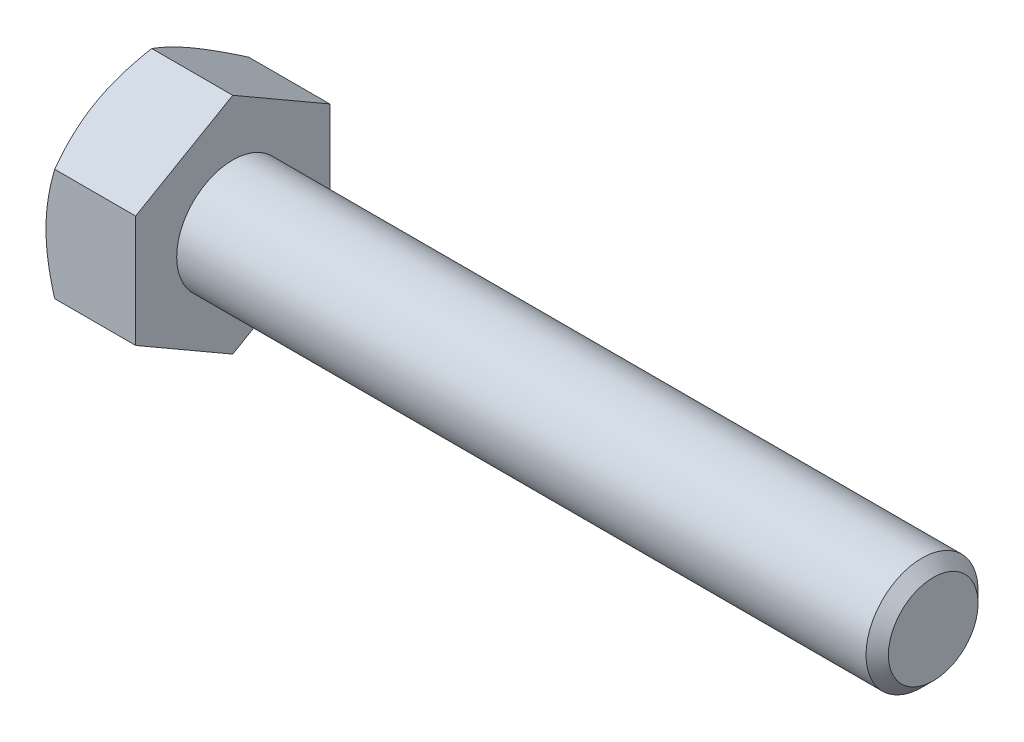
ISO-10303-21;
HEADER;
FILE_DESCRIPTION(('STEP AP214'),'2;1');
FILE_NAME('part.step','',(''),(''),'','','');
FILE_SCHEMA(('AUTOMOTIVE_DESIGN { 1 0 10303 214 1 1 1 1 }'));
ENDSEC;
DATA;
#1=APPLICATION_CONTEXT('core data for automotive mechanical design processes');
#2=APPLICATION_PROTOCOL_DEFINITION('international standard','automotive_design',2000,#1);
#3=PRODUCT_CONTEXT('',#1,'mechanical');
#4=PRODUCT('Part','Part','',(#3));
#5=PRODUCT_RELATED_PRODUCT_CATEGORY('part','',(#4));
#6=PRODUCT_DEFINITION_FORMATION('','',#4);
#7=PRODUCT_DEFINITION_CONTEXT('part definition',#1,'design');
#8=PRODUCT_DEFINITION('design','',#6,#7);
#9=PRODUCT_DEFINITION_SHAPE('','',#8);
#10=(LENGTH_UNIT() NAMED_UNIT(*) SI_UNIT(.MILLI.,.METRE.));
#11=(NAMED_UNIT(*) PLANE_ANGLE_UNIT() SI_UNIT($,.RADIAN.));
#12=(NAMED_UNIT(*) SI_UNIT($,.STERADIAN.) SOLID_ANGLE_UNIT());
#13=UNCERTAINTY_MEASURE_WITH_UNIT(LENGTH_MEASURE(1.E-05),#10,'distance_accuracy_value','');
#14=(GEOMETRIC_REPRESENTATION_CONTEXT(3) GLOBAL_UNCERTAINTY_ASSIGNED_CONTEXT((#13)) GLOBAL_UNIT_ASSIGNED_CONTEXT((#10,
#11,#12)) REPRESENTATION_CONTEXT('',''));
#15=CARTESIAN_POINT('',(0.,0.,0.));
#16=DIRECTION('',(0.,0.,1.));
#17=DIRECTION('',(1.,0.,0.));
#18=AXIS2_PLACEMENT_3D('',#15,#16,#17);
#19=CARTESIAN_POINT('',(19.2,-24.,0.));
#20=DIRECTION('',(0.,0.866025403784439,0.5));
#21=DIRECTION('',(0.,-0.5,0.866025403784439));
#22=AXIS2_PLACEMENT_3D('',#19,#20,#21);
#23=PLANE('',#22);
#24=CARTESIAN_POINT('',(1.85647312769879,-11.9998845299462,-20.7848096908265));
#25=CARTESIAN_POINT('',(1.70420497682991,-12.2636394383128,-20.3279727887898));
#26=CARTESIAN_POINT('',(1.55884654250784,-12.5284231322602,-19.8693539778572));
#27=CARTESIAN_POINT('',(1.28386975831447,-13.0601137691589,-18.94843878084));
#28=CARTESIAN_POINT('',(1.15425658531418,-13.3270213798629,-18.4861412381739));
#29=CARTESIAN_POINT('',(0.91251259584675,-13.8634756923534,-17.5569751130009));
#30=CARTESIAN_POINT('',(0.800423144133503,-14.1330270885871,-17.090098399473));
#31=CARTESIAN_POINT('',(0.596133528378372,-14.6740028630393,-16.1531008724579));
#32=CARTESIAN_POINT('',(0.503932225275743,-14.9454271330726,-15.6829802463528));
#33=CARTESIAN_POINT('',(0.343340490949204,-15.4831938662327,-14.7515409418993));
#34=CARTESIAN_POINT('',(0.274418527658162,-15.7494964060008,-14.2902914128362));
#35=CARTESIAN_POINT('',(0.158852016136895,-16.2833217102036,-13.3656788635911));
#36=CARTESIAN_POINT('',(0.112207896719893,-16.550844498026,-12.9023158029002));
#37=CARTESIAN_POINT('',(0.0423748141827231,-17.0863394659307,-11.9748113112918));
#38=CARTESIAN_POINT('',(0.019157979528038,-17.3543107311895,-11.5106714648951));
#39=CARTESIAN_POINT('',(-0.00332126042467924,-17.8905005573784,-10.5819634434344));
#40=CARTESIAN_POINT('',(-0.00258440592872337,-18.1587191104109,-10.1173952820495));
#41=CARTESIAN_POINT('',(0.0211707638629703,-18.6601588540007,-9.24887616921765));
#42=CARTESIAN_POINT('',(0.0412923456682149,-18.8934157559948,-8.84486336374767));
#43=CARTESIAN_POINT('',(0.0992698070061952,-19.3593726906644,-8.03780227876085));
#44=CARTESIAN_POINT('',(0.137125432541251,-19.5920727312676,-7.63475398551279));
#45=CARTESIAN_POINT('',(0.229914897964639,-20.0568299673038,-6.82977083951291));
#46=CARTESIAN_POINT('',(0.284864181366468,-20.2888863892025,-6.42783732656166));
#47=CARTESIAN_POINT('',(0.410868445121498,-20.7518881017849,-5.62589483637754));
#48=CARTESIAN_POINT('',(0.4819233572336,-20.9828333971723,-5.22588585099759));
#49=CARTESIAN_POINT('',(0.721070058737215,-21.6839341778009,-4.01154367772263));
#50=CARTESIAN_POINT('',(0.913020547282516,-22.1520977019199,-3.20066066769799));
#51=CARTESIAN_POINT('',(1.23980731969377,-22.8491727977797,-1.99329118497797));
#52=CARTESIAN_POINT('',(1.35509548926814,-23.0804697165365,-1.59267317005704));
#53=CARTESIAN_POINT('',(1.59734334708932,-23.541463698911,-0.794208170600854));
#54=CARTESIAN_POINT('',(1.72429974567885,-23.7711611939319,-0.396360438853306));
#55=CARTESIAN_POINT('',(1.8564731276988,-24.0001154700538,0.000200000000007566));
#56=B_SPLINE_CURVE_WITH_KNOTS('',3,(#24,#25,#26,#27,#28,#29,#30,#31,#32,#33,#34,#35,#36,#37,#38,
#39,#40,#41,#42,#43,#44,#45,#46,#47,#48,#49,#50,#51,#52,#53,#54,#55),.UNSPECIFIED.,.F.,.F.,(4,2,
2,2,2,2,2,2,2,2,2,2,2,2,2,4),(0.,1.64718297300076,3.29490606443561,4.94646171874215,
6.59792275780601,8.2086223270406,9.81935289844249,11.4281649098404,13.0369272065082,
14.4374315945823,15.8379159244004,17.2396692350121,18.6414166063712,21.5066563429885,
22.9367804503372,24.3665025883493),.UNSPECIFIED.);
#57=CARTESIAN_POINT('',(1.85640646055101,-12.,-20.7846096908265));
#58=VERTEX_POINT('',#57);
#59=CARTESIAN_POINT('',(0.,-18.,-10.3923048454133));
#60=VERTEX_POINT('',#59);
#61=EDGE_CURVE('E147',#58,#60,#56,.T.);
#62=ORIENTED_EDGE('',*,*,#61,.F.);
#63=DIRECTION('',(-1.,0.,0.));
#64=VECTOR('',#63,1.);
#65=CARTESIAN_POINT('',(19.2,-12.,-20.7846096908265));
#66=LINE('',#65,#64);
#67=CARTESIAN_POINT('',(19.2,-12.,-20.7846096908265));
#68=VERTEX_POINT('',#67);
#69=EDGE_CURVE('E161',#68,#58,#66,.T.);
#70=ORIENTED_EDGE('',*,*,#69,.F.);
#71=DIRECTION('',(0.,0.5,-0.866025403784439));
#72=VECTOR('',#71,1.);
#73=CARTESIAN_POINT('',(19.2,-24.,0.));
#74=LINE('',#73,#72);
#75=CARTESIAN_POINT('',(19.2,-24.,0.));
#76=VERTEX_POINT('',#75);
#77=EDGE_CURVE('E259',#76,#68,#74,.T.);
#78=ORIENTED_EDGE('',*,*,#77,.F.);
#79=DIRECTION('',(-1.,0.,0.));
#80=VECTOR('',#79,1.);
#81=CARTESIAN_POINT('',(19.2,-24.,0.));
#82=LINE('',#81,#80);
#83=CARTESIAN_POINT('',(1.85640646055101,-24.,0.));
#84=VERTEX_POINT('',#83);
#85=EDGE_CURVE('E280',#76,#84,#82,.T.);
#86=ORIENTED_EDGE('',*,*,#85,.T.);
#87=EDGE_CURVE('E214',#60,#84,#56,.T.);
#88=ORIENTED_EDGE('',*,*,#87,.F.);
#89=EDGE_LOOP('',(#62,#70,#78,#86,#88));
#90=FACE_BOUND('',#89,.T.);
#91=ADVANCED_FACE('F52',(#90),#23,.F.);
#92=CARTESIAN_POINT('',(19.2,-12.,-20.7846096908265));
#93=DIRECTION('',(0.,0.,1.));
#94=DIRECTION('',(1.,0.,0.));
#95=AXIS2_PLACEMENT_3D('',#92,#93,#94);
#96=PLANE('',#95);
#97=CARTESIAN_POINT('',(15.4365753826942,42.7351963396777,-20.7846096908265));
#98=CARTESIAN_POINT('',(15.1782001230141,42.2375504579258,-20.7846096908265));
#99=CARTESIAN_POINT('',(14.9205008424216,41.7395537279378,-20.7846096908265));
#100=CARTESIAN_POINT('',(14.4065935235221,40.7427897192709,-20.7846096908265));
#101=CARTESIAN_POINT('',(14.1503854894428,40.2440224384126,-20.7846096908265));
#102=CARTESIAN_POINT('',(13.3841874976782,38.7464229614954,-20.7846096908265));
#103=CARTESIAN_POINT('',(12.8766458079479,37.7463357499289,-20.7846096908265));
#104=CARTESIAN_POINT('',(11.8687046110495,35.740585285373,-20.7846096908265));
#105=CARTESIAN_POINT('',(11.3683176523895,34.7349157197309,-20.7846096908265));
#106=CARTESIAN_POINT('',(10.3773529444861,32.718765685221,-20.7846096908265));
#107=CARTESIAN_POINT('',(9.88677504418477,31.7082852907364,-20.7846096908265));
#108=CARTESIAN_POINT('',(8.89098212398311,29.6253151675214,-20.7846096908265));
#109=CARTESIAN_POINT('',(8.38646255239789,28.5524923063502,-20.7846096908265));
#110=CARTESIAN_POINT('',(7.39477343103312,26.398760720087,-20.7846096908265));
#111=CARTESIAN_POINT('',(6.9076046018839,25.3178516614009,-20.7846096908265));
#112=CARTESIAN_POINT('',(6.19395911010642,23.6893359387004,-20.7846096908265));
#113=CARTESIAN_POINT('',(5.95898796329796,23.1454489410646,-20.7846096908265));
#114=CARTESIAN_POINT('',(5.49555007418072,22.0549139153183,-20.7846096908265));
#115=CARTESIAN_POINT('',(5.26708324689029,21.5082659233915,-20.7846096908265));
#116=CARTESIAN_POINT('',(4.81763359191787,20.4119412090459,-20.7846096908265));
#117=CARTESIAN_POINT('',(4.59665024200561,19.8622647010961,-20.7846096908265));
#118=CARTESIAN_POINT('',(4.16330092883257,18.7595322812737,-20.7846096908265));
#119=CARTESIAN_POINT('',(3.9509347919298,18.2064764377555,-20.7846096908265));
#120=CARTESIAN_POINT('',(3.50964661408538,17.0257175003698,-20.7846096908265));
#121=CARTESIAN_POINT('',(3.28207699733136,16.3975069770108,-20.7846096908265));
#122=CARTESIAN_POINT('',(2.84185286992129,15.1358634730652,-20.7846096908265));
#123=CARTESIAN_POINT('',(2.62919832486909,14.502430504526,-20.7846096908265));
#124=CARTESIAN_POINT('',(2.22142797041994,13.2297874539747,-20.7846096908265));
#125=CARTESIAN_POINT('',(2.02631541783626,12.5905763233441,-20.7846096908265));
#126=CARTESIAN_POINT('',(1.65674077494716,11.3061766050275,-20.7846096908265));
#127=CARTESIAN_POINT('',(1.48227865352407,10.6609880263503,-20.7846096908265));
#128=CARTESIAN_POINT('',(1.16069442824225,9.37757944037591,-20.7846096908265));
#129=CARTESIAN_POINT('',(1.01309291973355,8.73948035870573,-20.7846096908265));
#130=CARTESIAN_POINT('',(0.744428159888315,7.45773163993493,-20.7846096908265));
#131=CARTESIAN_POINT('',(0.623362581757378,6.81408249463786,-20.7846096908265));
#132=CARTESIAN_POINT('',(0.411160078732887,5.52212335543822,-20.7846096908265));
#133=CARTESIAN_POINT('',(0.32000954243902,4.87381561880368,-20.7846096908265));
#134=CARTESIAN_POINT('',(0.170501882779787,3.57339987577272,-20.7846096908265));
#135=CARTESIAN_POINT('',(0.112144274499399,2.92129192571484,-20.7846096908265));
#136=CARTESIAN_POINT('',(0.0296859334714005,1.60463292415903,-20.7846096908265));
#137=CARTESIAN_POINT('',(0.00613586787264648,0.940046910142551,-20.7846096908265));
#138=CARTESIAN_POINT('',(-0.00403039108904673,-0.389409138129738,-20.7846096908265));
#139=CARTESIAN_POINT('',(0.00935336688645092,-1.05427917201018,-20.7846096908265));
#140=CARTESIAN_POINT('',(0.0725267417839732,-2.38241239876368,-20.7846096908265));
#141=CARTESIAN_POINT('',(0.122324318983761,-3.04567520847448,-20.7846096908265));
#142=CARTESIAN_POINT('',(0.256441221489194,-4.36867761851293,-20.7846096908265));
#143=CARTESIAN_POINT('',(0.340761456006634,-5.02841712558489,-20.7846096908265));
#144=CARTESIAN_POINT('',(0.543132854242181,-6.356870471909,-20.7846096908265));
#145=CARTESIAN_POINT('',(0.661856749114902,-7.02548085274416,-20.7846096908265));
#146=CARTESIAN_POINT('',(0.928598305854007,-8.3567871779243,-20.7846096908265));
#147=CARTESIAN_POINT('',(1.07661642314573,-9.01948303015109,-20.7846096908265));
#148=CARTESIAN_POINT('',(1.39817496043687,-10.3388158753969,-20.7846096908265));
#149=CARTESIAN_POINT('',(1.57172301041281,-10.9954509945151,-20.7846096908265));
#150=CARTESIAN_POINT('',(1.94066974695682,-12.3025159921132,-20.7846096908265));
#151=CARTESIAN_POINT('',(2.13606850262355,-12.9529458509631,-20.7846096908265));
#152=CARTESIAN_POINT('',(2.54787647733614,-14.2556215747884,-20.7846096908265));
#153=CARTESIAN_POINT('',(2.76450834199086,-14.907796699128,-20.7846096908265));
#154=CARTESIAN_POINT('',(3.21385089652053,-16.2066062021253,-20.7846096908265));
#155=CARTESIAN_POINT('',(3.44656260738666,-16.8532402260148,-20.7846096908265));
#156=CARTESIAN_POINT('',(3.92560832114499,-18.1416069191262,-20.7846096908265));
#157=CARTESIAN_POINT('',(4.17194567395357,-18.7833383384918,-20.7846096908265));
#158=CARTESIAN_POINT('',(4.6760882498381,-20.0622534059696,-20.7846096908265));
#159=CARTESIAN_POINT('',(4.93389324742563,-20.6994371432173,-20.7846096908265));
#160=CARTESIAN_POINT('',(5.45957252564695,-21.9705929002848,-20.7846096908265));
#161=CARTESIAN_POINT('',(5.72745939094395,-22.604559704099,-20.7846096908265));
#162=CARTESIAN_POINT('',(6.27153990979843,-23.8689150095967,-20.7846096908265));
#163=CARTESIAN_POINT('',(6.54773359625539,-24.4993034970964,-20.7846096908265));
#164=CARTESIAN_POINT('',(7.10718593411258,-25.7568294075045,-20.7846096908265));
#165=CARTESIAN_POINT('',(7.39044360966609,-26.3839672651679,-20.7846096908265));
#166=CARTESIAN_POINT('',(7.96306773382718,-27.6354418873609,-20.7846096908265));
#167=CARTESIAN_POINT('',(8.2524341698265,-28.2597786576686,-20.7846096908265));
#168=CARTESIAN_POINT('',(9.09261210441166,-30.0526700155559,-20.7846096908265));
#169=CARTESIAN_POINT('',(9.650064020441,-31.2181138600505,-20.7846096908265));
#170=CARTESIAN_POINT('',(10.7792267251682,-33.5421025420665,-20.7846096908265));
#171=CARTESIAN_POINT('',(11.3509380716336,-34.7006471075152,-20.7846096908265));
#172=CARTESIAN_POINT('',(12.5033567528949,-37.0077945469623,-20.7846096908265));
#173=CARTESIAN_POINT('',(13.0840220705692,-38.1564184327317,-20.7846096908265));
#174=CARTESIAN_POINT('',(13.9616188799111,-39.8759132018086,-20.7846096908265));
#175=CARTESIAN_POINT('',(14.2552377532654,-40.4484792332988,-20.7846096908265));
#176=CARTESIAN_POINT('',(14.8444666900635,-41.5925826559036,-20.7846096908265));
#177=CARTESIAN_POINT('',(15.1400767444053,-42.164120051705,-20.7846096908265));
#178=CARTESIAN_POINT('',(15.4365753826942,-42.7351963396777,-20.7846096908265));
#179=B_SPLINE_CURVE_WITH_KNOTS('',3,(#97,#98,#99,#100,#101,#102,#103,#104,#105,#106,#107,#108,
#109,#110,#111,#112,#113,#114,#115,#116,#117,#118,#119,#120,#121,#122,#123,#124,#125,#126,#127,
#128,#129,#130,#131,#132,#133,#134,#135,#136,#137,#138,#139,#140,#141,#142,#143,#144,#145,#146,
#147,#148,#149,#150,#151,#152,#153,#154,#155,#156,#157,#158,#159,#160,#161,#162,#163,#164,#165,
#166,#167,#168,#169,#170,#171,#172,#173,#174,#175,#176,#177,#178),.UNSPECIFIED.,.F.,.F.,(4,2,2,
2,2,2,2,2,2,2,2,2,2,2,2,2,2,2,2,2,2,2,2,2,2,2,2,2,2,2,2,2,2,2,2,2,2,2,2,2,4),(0.,
1.68216511624376,3.3643349990115,6.72881886572706,10.0986173985111,13.468363996922,
17.0248524624178,20.5814884680961,22.3588742955726,24.1362368900912,25.9134751956865,
27.6906776710652,29.69499374197,31.6993051905018,33.7039879905968,35.7086677698428,
37.6730184948026,39.6371969073429,41.6004803719791,43.5637348044197,45.5577279859555,
47.5517185403391,49.5461451232969,51.5406242361864,53.5770909409603,55.6135893083398,
57.650697552863,59.6878122395322,61.7492048973111,63.810728563878,65.8727613364008,
67.9347535810604,69.9994111245146,72.0640768461977,74.1284589098883,76.192836713184,
80.068401521298,83.9441181633394,87.8052301786373,89.7356145319588,91.6659900672801),.UNSPECIFIED.);
#180=CARTESIAN_POINT('',(1.85640646055101,12.,-20.7846096908265));
#181=VERTEX_POINT('',#180);
#182=CARTESIAN_POINT('',(0.,0.,-20.7846096908265));
#183=VERTEX_POINT('',#182);
#184=EDGE_CURVE('E125',#181,#183,#179,.T.);
#185=ORIENTED_EDGE('',*,*,#184,.F.);
#186=DIRECTION('',(-1.,0.,0.));
#187=VECTOR('',#186,1.);
#188=CARTESIAN_POINT('',(19.2,12.,-20.7846096908265));
#189=LINE('',#188,#187);
#190=CARTESIAN_POINT('',(19.2,12.,-20.7846096908265));
#191=VERTEX_POINT('',#190);
#192=EDGE_CURVE('E292',#191,#181,#189,.T.);
#193=ORIENTED_EDGE('',*,*,#192,.F.);
#194=DIRECTION('',(0.,1.,0.));
#195=VECTOR('',#194,1.);
#196=CARTESIAN_POINT('',(19.2,-12.,-20.7846096908265));
#197=LINE('',#196,#195);
#198=EDGE_CURVE('E262',#68,#191,#197,.T.);
#199=ORIENTED_EDGE('',*,*,#198,.F.);
#200=ORIENTED_EDGE('',*,*,#69,.T.);
#201=EDGE_CURVE('E139',#183,#58,#179,.T.);
#202=ORIENTED_EDGE('',*,*,#201,.F.);
#203=EDGE_LOOP('',(#185,#193,#199,#200,#202));
#204=FACE_BOUND('',#203,.T.);
#205=ADVANCED_FACE('F159',(#204),#96,.F.);
#206=CARTESIAN_POINT('',(19.2,12.,-20.7846096908265));
#207=DIRECTION('',(0.,-0.866025403784438,0.5));
#208=DIRECTION('',(0.,-0.5,-0.866025403784439));
#209=AXIS2_PLACEMENT_3D('',#206,#207,#208);
#210=PLANE('',#209);
#211=CARTESIAN_POINT('',(1.8564731276988,24.0001154700538,0.000199999999997352));
#212=CARTESIAN_POINT('',(1.70420497682991,23.7363605616872,-0.456636902036747));
#213=CARTESIAN_POINT('',(1.55884654250784,23.4715768677398,-0.915255712969352));
#214=CARTESIAN_POINT('',(1.28386975831447,22.9398862308411,-1.83617090998653));
#215=CARTESIAN_POINT('',(1.15425658531418,22.6729786201371,-2.29846845265265));
#216=CARTESIAN_POINT('',(0.912512595846755,22.1365243076466,-3.22763457782562));
#217=CARTESIAN_POINT('',(0.800423144133506,21.8669729114129,-3.69451129135353));
#218=CARTESIAN_POINT('',(0.596133528378374,21.3259971369607,-4.63150881836863));
#219=CARTESIAN_POINT('',(0.503932225275747,21.0545728669274,-5.10162944447372));
#220=CARTESIAN_POINT('',(0.343340490949207,20.5168061337673,-6.03306874892725));
#221=CARTESIAN_POINT('',(0.274418527658164,20.2505035939992,-6.4943182779903));
#222=CARTESIAN_POINT('',(0.158852016136896,19.7166782897964,-7.41893082723539));
#223=CARTESIAN_POINT('',(0.112207896719896,19.449155501974,-7.88229388792627));
#224=CARTESIAN_POINT('',(0.0423748141827268,18.9136605340693,-8.8097983795347));
#225=CARTESIAN_POINT('',(0.0191579795280403,18.6456892688105,-9.2739382259314));
#226=CARTESIAN_POINT('',(-0.0033212604246786,18.1094994426216,-10.2026462473922));
#227=CARTESIAN_POINT('',(-0.00258440592872306,17.8412808895891,-10.667214408777));
#228=CARTESIAN_POINT('',(0.0211707638629709,17.3398411459993,-11.5357335216089));
#229=CARTESIAN_POINT('',(0.041292345668216,17.1065842440052,-11.9397463270788));
#230=CARTESIAN_POINT('',(0.099269807006196,16.6406273093356,-12.7468074120657));
#231=CARTESIAN_POINT('',(0.137125432541251,16.4079272687324,-13.1498557053137));
#232=CARTESIAN_POINT('',(0.229914897964638,15.9431700326962,-13.9548388513136));
#233=CARTESIAN_POINT('',(0.284864181366468,15.7111136107975,-14.3567723642648));
#234=CARTESIAN_POINT('',(0.410868445121498,15.2481118982151,-15.158714854449));
#235=CARTESIAN_POINT('',(0.4819233572336,15.0171666028277,-15.5587238398289));
#236=CARTESIAN_POINT('',(0.721070058737214,14.3160658221991,-16.7730660131039));
#237=CARTESIAN_POINT('',(0.913020547282517,13.8479022980801,-17.5839490231285));
#238=CARTESIAN_POINT('',(1.23980731969377,13.1508272022203,-18.7913185058485));
#239=CARTESIAN_POINT('',(1.35509548926814,12.9195302834635,-19.1919365207695));
#240=CARTESIAN_POINT('',(1.59734334708932,12.458536301089,-19.9904015202257));
#241=CARTESIAN_POINT('',(1.72429974567884,12.2288388060681,-20.3882492519732));
#242=CARTESIAN_POINT('',(1.85647312769879,11.9998845299462,-20.7848096908265));
#243=B_SPLINE_CURVE_WITH_KNOTS('',3,(#211,#212,#213,#214,#215,#216,#217,#218,#219,#220,#221,
#222,#223,#224,#225,#226,#227,#228,#229,#230,#231,#232,#233,#234,#235,#236,#237,#238,#239,#240,
#241,#242),.UNSPECIFIED.,.F.,.F.,(4,2,2,2,2,2,2,2,2,2,2,2,2,2,2,4),(0.,1.64718297300076,
3.29490606443561,4.94646171874214,6.59792275780601,8.2086223270406,9.81935289844249,
11.4281649098404,13.0369272065082,14.4374315945823,15.8379159244004,17.2396692350121,
18.6414166063712,21.5066563429885,22.9367804503371,24.3665025883493),.UNSPECIFIED.);
#244=CARTESIAN_POINT('',(1.85640646055101,24.,0.));
#245=VERTEX_POINT('',#244);
#246=CARTESIAN_POINT('',(0.,18.,-10.3923048454133));
#247=VERTEX_POINT('',#246);
#248=EDGE_CURVE('E69',#245,#247,#243,.T.);
#249=ORIENTED_EDGE('',*,*,#248,.F.);
#250=DIRECTION('',(-1.,0.,0.));
#251=VECTOR('',#250,1.);
#252=CARTESIAN_POINT('',(19.2,24.,0.));
#253=LINE('',#252,#251);
#254=CARTESIAN_POINT('',(19.2,24.,0.));
#255=VERTEX_POINT('',#254);
#256=EDGE_CURVE('E255',#255,#245,#253,.T.);
#257=ORIENTED_EDGE('',*,*,#256,.F.);
#258=DIRECTION('',(0.,0.5,0.866025403784438));
#259=VECTOR('',#258,1.);
#260=CARTESIAN_POINT('',(19.2,12.,-20.7846096908265));
#261=LINE('',#260,#259);
#262=EDGE_CURVE('E266',#191,#255,#261,.T.);
#263=ORIENTED_EDGE('',*,*,#262,.F.);
#264=ORIENTED_EDGE('',*,*,#192,.T.);
#265=EDGE_CURVE('E132',#247,#181,#243,.T.);
#266=ORIENTED_EDGE('',*,*,#265,.F.);
#267=EDGE_LOOP('',(#249,#257,#263,#264,#266));
#268=FACE_BOUND('',#267,.T.);
#269=ADVANCED_FACE('F226',(#268),#210,.F.);
#270=CARTESIAN_POINT('',(19.2,24.,0.));
#271=DIRECTION('',(0.,-0.866025403784439,-0.5));
#272=DIRECTION('',(0.,0.5,-0.866025403784439));
#273=AXIS2_PLACEMENT_3D('',#270,#271,#272);
#274=PLANE('',#273);
#275=CARTESIAN_POINT('',(1.8564731276988,11.9998845299462,20.7848096908265));
#276=CARTESIAN_POINT('',(1.70420497682991,12.2636394383128,20.3279727887898));
#277=CARTESIAN_POINT('',(1.55884654250784,12.5284231322602,19.8693539778572));
#278=CARTESIAN_POINT('',(1.28386975831447,13.0601137691589,18.94843878084));
#279=CARTESIAN_POINT('',(1.15425658531419,13.3270213798629,18.4861412381739));
#280=CARTESIAN_POINT('',(0.912512595846756,13.8634756923534,17.5569751130009));
#281=CARTESIAN_POINT('',(0.800423144133506,14.1330270885871,17.090098399473));
#282=CARTESIAN_POINT('',(0.596133528378374,14.6740028630393,16.1531008724579));
#283=CARTESIAN_POINT('',(0.503932225275748,14.9454271330726,15.6829802463528));
#284=CARTESIAN_POINT('',(0.343340490949208,15.4831938662327,14.7515409418993));
#285=CARTESIAN_POINT('',(0.274418527658166,15.7494964060008,14.2902914128362));
#286=CARTESIAN_POINT('',(0.158852016136898,16.2833217102036,13.3656788635911));
#287=CARTESIAN_POINT('',(0.112207896719896,16.550844498026,12.9023158029003));
#288=CARTESIAN_POINT('',(0.0423748141827266,17.0863394659307,11.9748113112918));
#289=CARTESIAN_POINT('',(0.0191579795280406,17.3543107311895,11.5106714648951));
#290=CARTESIAN_POINT('',(-0.00332126042467685,17.8905005573784,10.5819634434344));
#291=CARTESIAN_POINT('',(-0.00258440592872026,18.1587191104109,10.1173952820495));
#292=CARTESIAN_POINT('',(0.0211707638629732,18.6601588540007,9.24887616921766));
#293=CARTESIAN_POINT('',(0.041292345668217,18.8934157559948,8.84486336374767));
#294=CARTESIAN_POINT('',(0.099269807006197,19.3593726906644,8.03780227876086));
#295=CARTESIAN_POINT('',(0.137125432541253,19.5920727312676,7.63475398551279));
#296=CARTESIAN_POINT('',(0.229914897964641,20.0568299673038,6.82977083951291));
#297=CARTESIAN_POINT('',(0.284864181366471,20.2888863892025,6.42783732656167));
#298=CARTESIAN_POINT('',(0.410868445121501,20.7518881017849,5.62589483637754));
#299=CARTESIAN_POINT('',(0.481923357233605,20.9828333971723,5.22588585099759));
#300=CARTESIAN_POINT('',(0.721070058737221,21.6839341778009,4.01154367772263));
#301=CARTESIAN_POINT('',(0.913020547282523,22.1520977019199,3.20066066769799));
#302=CARTESIAN_POINT('',(1.23980731969377,22.8491727977797,1.99329118497797));
#303=CARTESIAN_POINT('',(1.35509548926815,23.0804697165365,1.59267317005704));
#304=CARTESIAN_POINT('',(1.59734334708933,23.541463698911,0.794208170600857));
#305=CARTESIAN_POINT('',(1.72429974567885,23.7711611939319,0.39636043885331));
#306=CARTESIAN_POINT('',(1.8564731276988,24.0001154700538,-0.000200000000004068));
#307=B_SPLINE_CURVE_WITH_KNOTS('',3,(#275,#276,#277,#278,#279,#280,#281,#282,#283,#284,#285,
#286,#287,#288,#289,#290,#291,#292,#293,#294,#295,#296,#297,#298,#299,#300,#301,#302,#303,#304,
#305,#306),.UNSPECIFIED.,.F.,.F.,(4,2,2,2,2,2,2,2,2,2,2,2,2,2,2,4),(0.,1.64718297300077,
3.29490606443561,4.94646171874214,6.59792275780601,8.2086223270406,9.81935289844249,
11.4281649098404,13.0369272065082,14.4374315945823,15.8379159244004,17.2396692350121,
18.6414166063712,21.5066563429886,22.9367804503372,24.3665025883493),.UNSPECIFIED.);
#308=CARTESIAN_POINT('',(1.85640646055099,12.,20.7846096908265));
#309=VERTEX_POINT('',#308);
#310=CARTESIAN_POINT('',(0.,18.,10.3923048454133));
#311=VERTEX_POINT('',#310);
#312=EDGE_CURVE('E77',#309,#311,#307,.T.);
#313=ORIENTED_EDGE('',*,*,#312,.F.);
#314=DIRECTION('',(-1.,0.,0.));
#315=VECTOR('',#314,1.);
#316=CARTESIAN_POINT('',(19.2,12.,20.7846096908265));
#317=LINE('',#316,#315);
#318=CARTESIAN_POINT('',(19.2,12.,20.7846096908265));
#319=VERTEX_POINT('',#318);
#320=EDGE_CURVE('E287',#319,#309,#317,.T.);
#321=ORIENTED_EDGE('',*,*,#320,.F.);
#322=DIRECTION('',(0.,-0.5,0.866025403784439));
#323=VECTOR('',#322,1.);
#324=CARTESIAN_POINT('',(19.2,24.,0.));
#325=LINE('',#324,#323);
#326=EDGE_CURVE('E271',#255,#319,#325,.T.);
#327=ORIENTED_EDGE('',*,*,#326,.F.);
#328=ORIENTED_EDGE('',*,*,#256,.T.);
#329=EDGE_CURVE('E138',#311,#245,#307,.T.);
#330=ORIENTED_EDGE('',*,*,#329,.F.);
#331=EDGE_LOOP('',(#313,#321,#327,#328,#330));
#332=FACE_BOUND('',#331,.T.);
#333=ADVANCED_FACE('F250',(#332),#274,.F.);
#334=CARTESIAN_POINT('',(19.2,12.,20.7846096908265));
#335=DIRECTION('',(0.,0.,-1.));
#336=DIRECTION('',(-1.,0.,0.));
#337=AXIS2_PLACEMENT_3D('',#334,#335,#336);
#338=PLANE('',#337);
#339=CARTESIAN_POINT('',(15.4365753826942,-42.7351963396777,20.7846096908265));
#340=CARTESIAN_POINT('',(15.1782001230141,-42.2375504579258,20.7846096908265));
#341=CARTESIAN_POINT('',(14.9205008424216,-41.7395537279378,20.7846096908265));
#342=CARTESIAN_POINT('',(14.4065935235221,-40.7427897192709,20.7846096908265));
#343=CARTESIAN_POINT('',(14.1503854894428,-40.2440224384126,20.7846096908265));
#344=CARTESIAN_POINT('',(13.3841874976782,-38.7464229614954,20.7846096908265));
#345=CARTESIAN_POINT('',(12.8766458079479,-37.7463357499288,20.7846096908265));
#346=CARTESIAN_POINT('',(11.8687046110494,-35.7405852853729,20.7846096908265));
#347=CARTESIAN_POINT('',(11.3683176523895,-34.7349157197309,20.7846096908265));
#348=CARTESIAN_POINT('',(10.3773529444861,-32.718765685221,20.7846096908265));
#349=CARTESIAN_POINT('',(9.88677504418476,-31.7082852907364,20.7846096908265));
#350=CARTESIAN_POINT('',(8.89098212398311,-29.6253151675214,20.7846096908265));
#351=CARTESIAN_POINT('',(8.38646255239788,-28.5524923063502,20.7846096908265));
#352=CARTESIAN_POINT('',(7.39477343103312,-26.398760720087,20.7846096908265));
#353=CARTESIAN_POINT('',(6.90760460188389,-25.3178516614009,20.7846096908265));
#354=CARTESIAN_POINT('',(6.19395911010642,-23.6893359387004,20.7846096908265));
#355=CARTESIAN_POINT('',(5.95898796329796,-23.1454489410646,20.7846096908265));
#356=CARTESIAN_POINT('',(5.49555007418072,-22.0549139153183,20.7846096908265));
#357=CARTESIAN_POINT('',(5.26708324689028,-21.5082659233914,20.7846096908265));
#358=CARTESIAN_POINT('',(4.81763359191786,-20.4119412090459,20.7846096908265));
#359=CARTESIAN_POINT('',(4.5966502420056,-19.8622647010961,20.7846096908265));
#360=CARTESIAN_POINT('',(4.16330092883256,-18.7595322812737,20.7846096908265));
#361=CARTESIAN_POINT('',(3.95093479192979,-18.2064764377555,20.7846096908265));
#362=CARTESIAN_POINT('',(3.50964661408537,-17.0257175003698,20.7846096908265));
#363=CARTESIAN_POINT('',(3.28207699733136,-16.3975069770108,20.7846096908265));
#364=CARTESIAN_POINT('',(2.84185286992129,-15.1358634730652,20.7846096908265));
#365=CARTESIAN_POINT('',(2.62919832486908,-14.502430504526,20.7846096908265));
#366=CARTESIAN_POINT('',(2.22142797041994,-13.2297874539747,20.7846096908265));
#367=CARTESIAN_POINT('',(2.02631541783626,-12.5905763233441,20.7846096908265));
#368=CARTESIAN_POINT('',(1.65674077494716,-11.3061766050274,20.7846096908265));
#369=CARTESIAN_POINT('',(1.48227865352407,-10.6609880263503,20.7846096908265));
#370=CARTESIAN_POINT('',(1.16069442824225,-9.37757944037589,20.7846096908265));
#371=CARTESIAN_POINT('',(1.01309291973355,-8.73948035870571,20.7846096908265));
#372=CARTESIAN_POINT('',(0.744428159888316,-7.45773163993491,20.7846096908265));
#373=CARTESIAN_POINT('',(0.623362581757381,-6.81408249463783,20.7846096908265));
#374=CARTESIAN_POINT('',(0.411160078732891,-5.5221233554382,20.7846096908265));
#375=CARTESIAN_POINT('',(0.320009542439022,-4.87381561880365,20.7846096908265));
#376=CARTESIAN_POINT('',(0.170501882779789,-3.5733998757727,20.7846096908265));
#377=CARTESIAN_POINT('',(0.112144274499402,-2.92129192571482,20.7846096908265));
#378=CARTESIAN_POINT('',(0.0296859334714053,-1.60463292415902,20.7846096908265));
#379=CARTESIAN_POINT('',(0.00613586787265187,-0.940046910142535,20.7846096908265));
#380=CARTESIAN_POINT('',(-0.00403039108904013,0.389409138129753,20.7846096908265));
#381=CARTESIAN_POINT('',(0.00935336688645845,1.0542791720102,20.7846096908265));
#382=CARTESIAN_POINT('',(0.0725267417839815,2.3824123987637,20.7846096908265));
#383=CARTESIAN_POINT('',(0.12232431898377,3.0456752084745,20.7846096908265));
#384=CARTESIAN_POINT('',(0.256441221489202,4.36867761851294,20.7846096908265));
#385=CARTESIAN_POINT('',(0.340761456006642,5.02841712558491,20.7846096908265));
#386=CARTESIAN_POINT('',(0.54313285424219,6.35687047190901,20.7846096908265));
#387=CARTESIAN_POINT('',(0.66185674911491,7.02548085274418,20.7846096908265));
#388=CARTESIAN_POINT('',(0.928598305854015,8.35678717792432,20.7846096908265));
#389=CARTESIAN_POINT('',(1.07661642314574,9.01948303015111,20.7846096908265));
#390=CARTESIAN_POINT('',(1.39817496043688,10.3388158753969,20.7846096908265));
#391=CARTESIAN_POINT('',(1.57172301041282,10.9954509945151,20.7846096908265));
#392=CARTESIAN_POINT('',(1.94066974695683,12.3025159921133,20.7846096908265));
#393=CARTESIAN_POINT('',(2.13606850262356,12.9529458509631,20.7846096908265));
#394=CARTESIAN_POINT('',(2.54787647733615,14.2556215747884,20.7846096908265));
#395=CARTESIAN_POINT('',(2.76450834199087,14.9077966991281,20.7846096908265));
#396=CARTESIAN_POINT('',(3.21385089652054,16.2066062021254,20.7846096908265));
#397=CARTESIAN_POINT('',(3.44656260738666,16.8532402260149,20.7846096908265));
#398=CARTESIAN_POINT('',(3.925608321145,18.1416069191262,20.7846096908265));
#399=CARTESIAN_POINT('',(4.17194567395358,18.7833383384918,20.7846096908265));
#400=CARTESIAN_POINT('',(4.67608824983811,20.0622534059696,20.7846096908265));
#401=CARTESIAN_POINT('',(4.93389324742564,20.6994371432173,20.7846096908265));
#402=CARTESIAN_POINT('',(5.45957252564696,21.9705929002849,20.7846096908265));
#403=CARTESIAN_POINT('',(5.72745939094396,22.604559704099,20.7846096908265));
#404=CARTESIAN_POINT('',(6.27153990979845,23.8689150095967,20.7846096908265));
#405=CARTESIAN_POINT('',(6.54773359625541,24.4993034970964,20.7846096908265));
#406=CARTESIAN_POINT('',(7.10718593411259,25.7568294075045,20.7846096908265));
#407=CARTESIAN_POINT('',(7.3904436096661,26.3839672651679,20.7846096908265));
#408=CARTESIAN_POINT('',(7.96306773382719,27.6354418873609,20.7846096908265));
#409=CARTESIAN_POINT('',(8.25243416982651,28.2597786576686,20.7846096908265));
#410=CARTESIAN_POINT('',(9.09261210441168,30.052670015556,20.7846096908265));
#411=CARTESIAN_POINT('',(9.65006402044101,31.2181138600505,20.7846096908265));
#412=CARTESIAN_POINT('',(10.7792267251682,33.5421025420665,20.7846096908265));
#413=CARTESIAN_POINT('',(11.3509380716337,34.7006471075152,20.7846096908265));
#414=CARTESIAN_POINT('',(12.5033567528949,37.0077945469623,20.7846096908265));
#415=CARTESIAN_POINT('',(13.0840220705692,38.1564184327317,20.7846096908265));
#416=CARTESIAN_POINT('',(13.9616188799111,39.8759132018086,20.7846096908265));
#417=CARTESIAN_POINT('',(14.2552377532654,40.4484792332988,20.7846096908265));
#418=CARTESIAN_POINT('',(14.8444666900635,41.5925826559036,20.7846096908265));
#419=CARTESIAN_POINT('',(15.1400767444053,42.164120051705,20.7846096908265));
#420=CARTESIAN_POINT('',(15.4365753826942,42.7351963396777,20.7846096908265));
#421=B_SPLINE_CURVE_WITH_KNOTS('',3,(#339,#340,#341,#342,#343,#344,#345,#346,#347,#348,#349,
#350,#351,#352,#353,#354,#355,#356,#357,#358,#359,#360,#361,#362,#363,#364,#365,#366,#367,#368,
#369,#370,#371,#372,#373,#374,#375,#376,#377,#378,#379,#380,#381,#382,#383,#384,#385,#386,#387,
#388,#389,#390,#391,#392,#393,#394,#395,#396,#397,#398,#399,#400,#401,#402,#403,#404,#405,#406,
#407,#408,#409,#410,#411,#412,#413,#414,#415,#416,#417,#418,#419,#420),.UNSPECIFIED.,.F.,.F.,(4,
2,2,2,2,2,2,2,2,2,2,2,2,2,2,2,2,2,2,2,2,2,2,2,2,2,2,2,2,2,2,2,2,2,2,2,2,2,2,2,4),(0.,
1.68216511624377,3.36433499901151,6.72881886572707,10.0986173985111,13.4683639969219,
17.0248524624178,20.5814884680961,22.3588742955726,24.1362368900912,25.9134751956865,
27.6906776710652,29.69499374197,31.6993051905018,33.7039879905968,35.7086677698428,
37.6730184948026,39.6371969073429,41.6004803719791,43.5637348044197,45.5577279859555,
47.5517185403391,49.5461451232969,51.5406242361864,53.5770909409603,55.6135893083398,
57.650697552863,59.6878122395322,61.7492048973111,63.810728563878,65.8727613364008,
67.9347535810604,69.9994111245146,72.0640768461977,74.1284589098883,76.192836713184,
80.068401521298,83.9441181633394,87.8052301786373,89.7356145319588,91.6659900672801),.UNSPECIFIED.);
#422=CARTESIAN_POINT('',(1.85640646055101,-12.,20.7846096908265));
#423=VERTEX_POINT('',#422);
#424=CARTESIAN_POINT('',(0.,0.,20.7846096908265));
#425=VERTEX_POINT('',#424);
#426=EDGE_CURVE('E207',#423,#425,#421,.T.);
#427=ORIENTED_EDGE('',*,*,#426,.F.);
#428=DIRECTION('',(-1.,0.,0.));
#429=VECTOR('',#428,1.);
#430=CARTESIAN_POINT('',(19.2,-12.,20.7846096908265));
#431=LINE('',#430,#429);
#432=CARTESIAN_POINT('',(19.2,-12.,20.7846096908265));
#433=VERTEX_POINT('',#432);
#434=EDGE_CURVE('E283',#433,#423,#431,.T.);
#435=ORIENTED_EDGE('',*,*,#434,.F.);
#436=DIRECTION('',(0.,-1.,0.));
#437=VECTOR('',#436,1.);
#438=CARTESIAN_POINT('',(19.2,12.,20.7846096908265));
#439=LINE('',#438,#437);
#440=EDGE_CURVE('E274',#319,#433,#439,.T.);
#441=ORIENTED_EDGE('',*,*,#440,.F.);
#442=ORIENTED_EDGE('',*,*,#320,.T.);
#443=EDGE_CURVE('E164',#425,#309,#421,.T.);
#444=ORIENTED_EDGE('',*,*,#443,.F.);
#445=EDGE_LOOP('',(#427,#435,#441,#442,#444));
#446=FACE_BOUND('',#445,.T.);
#447=ADVANCED_FACE('F336',(#446),#338,.F.);
#448=CARTESIAN_POINT('',(19.2,-12.,20.7846096908265));
#449=DIRECTION('',(0.,0.866025403784438,-0.5));
#450=DIRECTION('',(0.,0.5,0.866025403784439));
#451=AXIS2_PLACEMENT_3D('',#448,#449,#450);
#452=PLANE('',#451);
#453=CARTESIAN_POINT('',(1.8564731276988,-24.0001154700538,-0.000199999999993102));
#454=CARTESIAN_POINT('',(1.70420497682991,-23.7363605616872,0.45663690203675));
#455=CARTESIAN_POINT('',(1.55884654250784,-23.4715768677398,0.915255712969354));
#456=CARTESIAN_POINT('',(1.28386975831447,-22.9398862308411,1.83617090998653));
#457=CARTESIAN_POINT('',(1.15425658531418,-22.6729786201371,2.29846845265266));
#458=CARTESIAN_POINT('',(0.912512595846753,-22.1365243076466,3.22763457782562));
#459=CARTESIAN_POINT('',(0.800423144133504,-21.8669729114129,3.69451129135354));
#460=CARTESIAN_POINT('',(0.596133528378372,-21.3259971369607,4.63150881836863));
#461=CARTESIAN_POINT('',(0.503932225275744,-21.0545728669274,5.10162944447372));
#462=CARTESIAN_POINT('',(0.343340490949204,-20.5168061337673,6.03306874892725));
#463=CARTESIAN_POINT('',(0.274418527658162,-20.2505035939992,6.4943182779903));
#464=CARTESIAN_POINT('',(0.158852016136895,-19.7166782897964,7.41893082723539));
#465=CARTESIAN_POINT('',(0.112207896719893,-19.449155501974,7.88229388792627));
#466=CARTESIAN_POINT('',(0.0423748141827218,-18.9136605340693,8.8097983795347));
#467=CARTESIAN_POINT('',(0.0191579795280349,-18.6456892688105,9.2739382259314));
#468=CARTESIAN_POINT('',(-0.00332126042468313,-18.1094994426216,10.2026462473922));
#469=CARTESIAN_POINT('',(-0.00258440592872628,-17.8412808895891,10.667214408777));
#470=CARTESIAN_POINT('',(0.0211707638629672,-17.3398411459993,11.5357335216089));
#471=CARTESIAN_POINT('',(0.0412923456682109,-17.1065842440052,11.9397463270788));
#472=CARTESIAN_POINT('',(0.0992698070061921,-16.6406273093356,12.7468074120657));
#473=CARTESIAN_POINT('',(0.137125432541249,-16.4079272687324,13.1498557053137));
#474=CARTESIAN_POINT('',(0.229914897964638,-15.9431700326962,13.9548388513136));
#475=CARTESIAN_POINT('',(0.284864181366466,-15.7111136107975,14.3567723642648));
#476=CARTESIAN_POINT('',(0.410868445121496,-15.2481118982151,15.158714854449));
#477=CARTESIAN_POINT('',(0.481923357233599,-15.0171666028277,15.5587238398289));
#478=CARTESIAN_POINT('',(0.721070058737216,-14.3160658221991,16.7730660131039));
#479=CARTESIAN_POINT('',(0.913020547282517,-13.8479022980801,17.5839490231285));
#480=CARTESIAN_POINT('',(1.23980731969377,-13.1508272022203,18.7913185058486));
#481=CARTESIAN_POINT('',(1.35509548926814,-12.9195302834635,19.1919365207695));
#482=CARTESIAN_POINT('',(1.59734334708932,-12.458536301089,19.9904015202257));
#483=CARTESIAN_POINT('',(1.72429974567884,-12.2288388060681,20.3882492519732));
#484=CARTESIAN_POINT('',(1.85647312769879,-11.9998845299462,20.7848096908265));
#485=B_SPLINE_CURVE_WITH_KNOTS('',3,(#453,#454,#455,#456,#457,#458,#459,#460,#461,#462,#463,
#464,#465,#466,#467,#468,#469,#470,#471,#472,#473,#474,#475,#476,#477,#478,#479,#480,#481,#482,
#483,#484),.UNSPECIFIED.,.F.,.F.,(4,2,2,2,2,2,2,2,2,2,2,2,2,2,2,4),(0.,1.64718297300076,
3.29490606443561,4.94646171874214,6.59792275780601,8.2086223270406,9.81935289844249,
11.4281649098404,13.0369272065082,14.4374315945823,15.8379159244004,17.2396692350121,
18.6414166063712,21.5066563429886,22.9367804503372,24.3665025883493),.UNSPECIFIED.);
#486=CARTESIAN_POINT('',(0.,-18.,10.3923048454133));
#487=VERTEX_POINT('',#486);
#488=EDGE_CURVE('E233',#84,#487,#485,.T.);
#489=ORIENTED_EDGE('',*,*,#488,.F.);
#490=ORIENTED_EDGE('',*,*,#85,.F.);
#491=DIRECTION('',(0.,-0.5,-0.866025403784439));
#492=VECTOR('',#491,1.);
#493=CARTESIAN_POINT('',(19.2,-12.,20.7846096908265));
#494=LINE('',#493,#492);
#495=EDGE_CURVE('E277',#433,#76,#494,.T.);
#496=ORIENTED_EDGE('',*,*,#495,.F.);
#497=ORIENTED_EDGE('',*,*,#434,.T.);
#498=EDGE_CURVE('E197',#487,#423,#485,.T.);
#499=ORIENTED_EDGE('',*,*,#498,.F.);
#500=EDGE_LOOP('',(#489,#490,#496,#497,#499));
#501=FACE_BOUND('',#500,.T.);
#502=ADVANCED_FACE('F331',(#501),#452,.F.);
#503=CARTESIAN_POINT('',(19.2,0.,0.));
#504=DIRECTION('',(1.,0.,0.));
#505=DIRECTION('',(0.,0.,-1.));
#506=AXIS2_PLACEMENT_3D('',#503,#504,#505);
#507=PLANE('',#506);
#508=CARTESIAN_POINT('',(19.2,0.,0.));
#509=DIRECTION('',(1.,0.,0.));
#510=DIRECTION('',(0.,0.,-1.));
#511=AXIS2_PLACEMENT_3D('',#508,#509,#510);
#512=CIRCLE('',#511,12.);
#513=CARTESIAN_POINT('',(19.2,0.,-12.));
#514=VERTEX_POINT('',#513);
#515=EDGE_CURVE('E152',#514,#514,#512,.T.);
#516=ORIENTED_EDGE('',*,*,#515,.F.);
#517=EDGE_LOOP('',(#516));
#518=FACE_BOUND('',#517,.T.);
#519=ORIENTED_EDGE('',*,*,#77,.T.);
#520=ORIENTED_EDGE('',*,*,#198,.T.);
#521=ORIENTED_EDGE('',*,*,#262,.T.);
#522=ORIENTED_EDGE('',*,*,#326,.T.);
#523=ORIENTED_EDGE('',*,*,#440,.T.);
#524=ORIENTED_EDGE('',*,*,#495,.T.);
#525=EDGE_LOOP('',(#519,#520,#521,#522,#523,#524));
#526=FACE_BOUND('',#525,.T.);
#527=ADVANCED_FACE('F312',(#518,#526),#507,.T.);
#528=CARTESIAN_POINT('',(169.2,0.,0.));
#529=DIRECTION('',(-1.,0.,0.));
#530=DIRECTION('',(0.,0.,1.));
#531=AXIS2_PLACEMENT_3D('',#528,#529,#530);
#532=CYLINDRICAL_SURFACE('',#531,12.);
#533=CARTESIAN_POINT('',(166.8,0.,0.));
#534=DIRECTION('',(1.,0.,0.));
#535=DIRECTION('',(0.,0.,-1.));
#536=AXIS2_PLACEMENT_3D('',#533,#534,#535);
#537=CIRCLE('',#536,12.);
#538=CARTESIAN_POINT('',(166.8,0.,12.));
#539=VERTEX_POINT('',#538);
#540=EDGE_CURVE('E12',#539,#539,#537,.F.);
#541=ORIENTED_EDGE('',*,*,#540,.T.);
#542=EDGE_LOOP('',(#541));
#543=FACE_BOUND('',#542,.T.);
#544=ORIENTED_EDGE('',*,*,#515,.T.);
#545=EDGE_LOOP('',(#544));
#546=FACE_BOUND('',#545,.T.);
#547=ADVANCED_FACE('F309',(#543,#546),#532,.T.);
#548=CARTESIAN_POINT('',(169.2,0.,0.));
#549=DIRECTION('',(1.,0.,0.));
#550=DIRECTION('',(0.,0.,-1.));
#551=AXIS2_PLACEMENT_3D('',#548,#549,#550);
#552=PLANE('',#551);
#553=CARTESIAN_POINT('',(169.2,0.,0.));
#554=DIRECTION('',(1.,0.,0.));
#555=DIRECTION('',(0.,0.,-1.));
#556=AXIS2_PLACEMENT_3D('',#553,#554,#555);
#557=CIRCLE('',#556,9.59999999999994);
#558=CARTESIAN_POINT('',(169.2,0.,9.59999999999996));
#559=VERTEX_POINT('',#558);
#560=EDGE_CURVE('E62',#559,#559,#557,.T.);
#561=ORIENTED_EDGE('',*,*,#560,.T.);
#562=EDGE_LOOP('',(#561));
#563=FACE_BOUND('',#562,.T.);
#564=ADVANCED_FACE('F192',(#563),#552,.T.);
#565=CARTESIAN_POINT('',(0.,0.,0.));
#566=DIRECTION('',(1.,0.,0.));
#567=DIRECTION('',(0.,0.,1.));
#568=AXIS2_PLACEMENT_3D('',#565,#566,#567);
#569=CONICAL_SURFACE('',#568,20.7846096908265,1.0471975511966);
#570=ORIENTED_EDGE('',*,*,#201,.T.);
#571=ORIENTED_EDGE('',*,*,#61,.T.);
#572=CARTESIAN_POINT('',(0.,0.,0.));
#573=DIRECTION('',(1.,0.,0.));
#574=DIRECTION('',(0.,0.,-1.));
#575=AXIS2_PLACEMENT_3D('',#572,#573,#574);
#576=CIRCLE('',#575,20.7846096908265);
#577=EDGE_CURVE('E144',#60,#183,#576,.T.);
#578=ORIENTED_EDGE('',*,*,#577,.T.);
#579=EDGE_LOOP('',(#570,#571,#578));
#580=FACE_BOUND('',#579,.T.);
#581=ADVANCED_FACE('F145',(#580),#569,.T.);
#582=ORIENTED_EDGE('',*,*,#87,.T.);
#583=ORIENTED_EDGE('',*,*,#488,.T.);
#584=EDGE_CURVE('E151',#487,#60,#576,.T.);
#585=ORIENTED_EDGE('',*,*,#584,.T.);
#586=EDGE_LOOP('',(#582,#583,#585));
#587=FACE_BOUND('',#586,.T.);
#588=ADVANCED_FACE('F321',(#587),#569,.T.);
#589=ORIENTED_EDGE('',*,*,#426,.T.);
#590=EDGE_CURVE('E247',#425,#487,#576,.T.);
#591=ORIENTED_EDGE('',*,*,#590,.T.);
#592=ORIENTED_EDGE('',*,*,#498,.T.);
#593=EDGE_LOOP('',(#589,#591,#592));
#594=FACE_BOUND('',#593,.T.);
#595=ADVANCED_FACE('F191',(#594),#569,.T.);
#596=ORIENTED_EDGE('',*,*,#312,.T.);
#597=CARTESIAN_POINT('',(0.,0.,0.));
#598=DIRECTION('',(-1.,0.,0.));
#599=DIRECTION('',(0.,0.,1.));
#600=AXIS2_PLACEMENT_3D('',#597,#598,#599);
#601=CIRCLE('',#600,20.7846096908265);
#602=EDGE_CURVE('E243',#425,#311,#601,.T.);
#603=ORIENTED_EDGE('',*,*,#602,.F.);
#604=ORIENTED_EDGE('',*,*,#443,.T.);
#605=EDGE_LOOP('',(#596,#603,#604));
#606=FACE_BOUND('',#605,.T.);
#607=ADVANCED_FACE('F190',(#606),#569,.T.);
#608=ORIENTED_EDGE('',*,*,#248,.T.);
#609=EDGE_CURVE('E156',#247,#311,#576,.T.);
#610=ORIENTED_EDGE('',*,*,#609,.T.);
#611=ORIENTED_EDGE('',*,*,#329,.T.);
#612=EDGE_LOOP('',(#608,#610,#611));
#613=FACE_BOUND('',#612,.T.);
#614=ADVANCED_FACE('F186',(#613),#569,.T.);
#615=ORIENTED_EDGE('',*,*,#265,.T.);
#616=ORIENTED_EDGE('',*,*,#184,.T.);
#617=EDGE_CURVE('E129',#183,#247,#576,.T.);
#618=ORIENTED_EDGE('',*,*,#617,.T.);
#619=EDGE_LOOP('',(#615,#616,#618));
#620=FACE_BOUND('',#619,.T.);
#621=ADVANCED_FACE('F127',(#620),#569,.T.);
#622=CARTESIAN_POINT('',(0.,0.,0.));
#623=DIRECTION('',(1.,0.,0.));
#624=DIRECTION('',(0.,0.,-1.));
#625=AXIS2_PLACEMENT_3D('',#622,#623,#624);
#626=PLANE('',#625);
#627=ORIENTED_EDGE('',*,*,#617,.F.);
#628=ORIENTED_EDGE('',*,*,#577,.F.);
#629=ORIENTED_EDGE('',*,*,#584,.F.);
#630=ORIENTED_EDGE('',*,*,#590,.F.);
#631=ORIENTED_EDGE('',*,*,#602,.T.);
#632=ORIENTED_EDGE('',*,*,#609,.F.);
#633=EDGE_LOOP('',(#627,#628,#629,#630,#631,#632));
#634=FACE_BOUND('',#633,.T.);
#635=ADVANCED_FACE('F154',(#634),#626,.F.);
#636=CARTESIAN_POINT('',(169.2,0.,0.));
#637=DIRECTION('',(-1.,0.,0.));
#638=DIRECTION('',(0.,0.,1.));
#639=AXIS2_PLACEMENT_3D('',#636,#637,#638);
#640=CONICAL_SURFACE('',#639,9.59999999999994,0.785398163397452);
#641=CARTESIAN_POINT('',(166.8,0.,12.));
#642=CARTESIAN_POINT('',(166.825,0.,11.975));
#643=CARTESIAN_POINT('',(166.85,0.,11.95));
#644=CARTESIAN_POINT('',(166.9,0.,11.9));
#645=CARTESIAN_POINT('',(166.925,0.,11.875));
#646=CARTESIAN_POINT('',(166.975,0.,11.825));
#647=CARTESIAN_POINT('',(167.,0.,11.8));
#648=CARTESIAN_POINT('',(167.05,0.,11.75));
#649=CARTESIAN_POINT('',(167.075,0.,11.725));
#650=CARTESIAN_POINT('',(167.125,0.,11.675));
#651=CARTESIAN_POINT('',(167.15,0.,11.65));
#652=CARTESIAN_POINT('',(167.2,0.,11.6));
#653=CARTESIAN_POINT('',(167.225,0.,11.575));
#654=CARTESIAN_POINT('',(167.275,0.,11.525));
#655=CARTESIAN_POINT('',(167.3,0.,11.5));
#656=CARTESIAN_POINT('',(167.35,0.,11.45));
#657=CARTESIAN_POINT('',(167.375,0.,11.425));
#658=CARTESIAN_POINT('',(167.425,0.,11.375));
#659=CARTESIAN_POINT('',(167.45,0.,11.35));
#660=CARTESIAN_POINT('',(167.5,0.,11.3));
#661=CARTESIAN_POINT('',(167.525,0.,11.275));
#662=CARTESIAN_POINT('',(167.575,0.,11.225));
#663=CARTESIAN_POINT('',(167.6,0.,11.2));
#664=CARTESIAN_POINT('',(167.65,0.,11.15));
#665=CARTESIAN_POINT('',(167.675,0.,11.125));
#666=CARTESIAN_POINT('',(167.725,0.,11.075));
#667=CARTESIAN_POINT('',(167.75,0.,11.05));
#668=CARTESIAN_POINT('',(167.8,0.,11.));
#669=CARTESIAN_POINT('',(167.825,0.,10.975));
#670=CARTESIAN_POINT('',(167.875,0.,10.925));
#671=CARTESIAN_POINT('',(167.9,0.,10.9));
#672=CARTESIAN_POINT('',(167.95,0.,10.85));
#673=CARTESIAN_POINT('',(167.975,0.,10.825));
#674=CARTESIAN_POINT('',(168.025,0.,10.775));
#675=CARTESIAN_POINT('',(168.05,0.,10.75));
#676=CARTESIAN_POINT('',(168.1,0.,10.7));
#677=CARTESIAN_POINT('',(168.125,0.,10.675));
#678=CARTESIAN_POINT('',(168.175,0.,10.625));
#679=CARTESIAN_POINT('',(168.2,0.,10.6));
#680=CARTESIAN_POINT('',(168.25,0.,10.55));
#681=CARTESIAN_POINT('',(168.275,0.,10.525));
#682=CARTESIAN_POINT('',(168.325,0.,10.475));
#683=CARTESIAN_POINT('',(168.35,0.,10.45));
#684=CARTESIAN_POINT('',(168.4,0.,10.4));
#685=CARTESIAN_POINT('',(168.425,0.,10.375));
#686=CARTESIAN_POINT('',(168.475,0.,10.325));
#687=CARTESIAN_POINT('',(168.5,0.,10.3));
#688=CARTESIAN_POINT('',(168.55,0.,10.25));
#689=CARTESIAN_POINT('',(168.575,0.,10.225));
#690=CARTESIAN_POINT('',(168.625,0.,10.175));
#691=CARTESIAN_POINT('',(168.65,0.,10.15));
#692=CARTESIAN_POINT('',(168.7,0.,10.1));
#693=CARTESIAN_POINT('',(168.725,0.,10.075));
#694=CARTESIAN_POINT('',(168.775,0.,10.025));
#695=CARTESIAN_POINT('',(168.8,0.,9.99999999999997));
#696=CARTESIAN_POINT('',(168.85,0.,9.94999999999997));
#697=CARTESIAN_POINT('',(168.875,0.,9.92499999999997));
#698=CARTESIAN_POINT('',(168.925,0.,9.87499999999996));
#699=CARTESIAN_POINT('',(168.95,0.,9.84999999999996));
#700=CARTESIAN_POINT('',(169.,0.,9.79999999999996));
#701=CARTESIAN_POINT('',(169.025,0.,9.77499999999996));
#702=CARTESIAN_POINT('',(169.075,0.,9.72499999999996));
#703=CARTESIAN_POINT('',(169.1,0.,9.69999999999996));
#704=CARTESIAN_POINT('',(169.15,0.,9.64999999999995));
#705=CARTESIAN_POINT('',(169.175,0.,9.62499999999995));
#706=CARTESIAN_POINT('',(169.2,0.,9.59999999999996));
#707=B_SPLINE_CURVE_WITH_KNOTS('',3,(#641,#642,#643,#644,#645,#646,#647,#648,#649,#650,#651,
#652,#653,#654,#655,#656,#657,#658,#659,#660,#661,#662,#663,#664,#665,#666,#667,#668,#669,#670,
#671,#672,#673,#674,#675,#676,#677,#678,#679,#680,#681,#682,#683,#684,#685,#686,#687,#688,#689,
#690,#691,#692,#693,#694,#695,#696,#697,#698,#699,#700,#701,#702,#703,#704,#705,#706),
.UNSPECIFIED.,.F.,.F.,(4,2,2,2,2,2,2,2,2,2,2,2,2,2,2,2,2,2,2,2,2,2,2,2,2,2,2,2,2,2,2,2,4),(0.,
0.106066017177997,0.212132034355975,0.318198051533973,0.42426406871195,0.530330085889928,
0.636396103067926,0.742462120245904,0.84852813742388,0.954594154601878,1.06066017177986,
1.16672618895783,1.27279220613583,1.37885822331381,1.48492424049178,1.59099025766978,
1.69705627484776,1.80312229202574,1.90918830920374,2.01525432638171,2.12132034355969,
2.22738636073769,2.33345237791567,2.43951839509364,2.54558441227164,2.65165042944962,
2.7577164466276,2.86378246380559,2.96984848098357,3.07591449816155,3.18198051533955,
3.28804653251752,3.39411254969552),.UNSPECIFIED.);
#708=EDGE_CURVE('BSEAM55',#539,#559,#707,.T.);
#709=ORIENTED_EDGE('',*,*,#540,.F.);
#710=ORIENTED_EDGE('',*,*,#560,.F.);
#711=ORIENTED_EDGE('',*,*,#708,.T.);
#712=ORIENTED_EDGE('',*,*,#708,.F.);
#713=EDGE_LOOP('',(#709,#711,#710,#712));
#714=FACE_BOUND('',#713,.T.);
#715=ADVANCED_FACE('F55',(#714),#640,.T.);
#716=CLOSED_SHELL('',(#91,#205,#269,#333,#447,#502,#527,#547,#564,#581,#588,#595,#607,#614,#621,
#635,#715));
#717=MANIFOLD_SOLID_BREP('B2',#716);
#718=ADVANCED_BREP_SHAPE_REPRESENTATION('',(#18,#717),#14);
#719=SHAPE_DEFINITION_REPRESENTATION(#9,#718);
ENDSEC;
END-ISO-10303-21;
